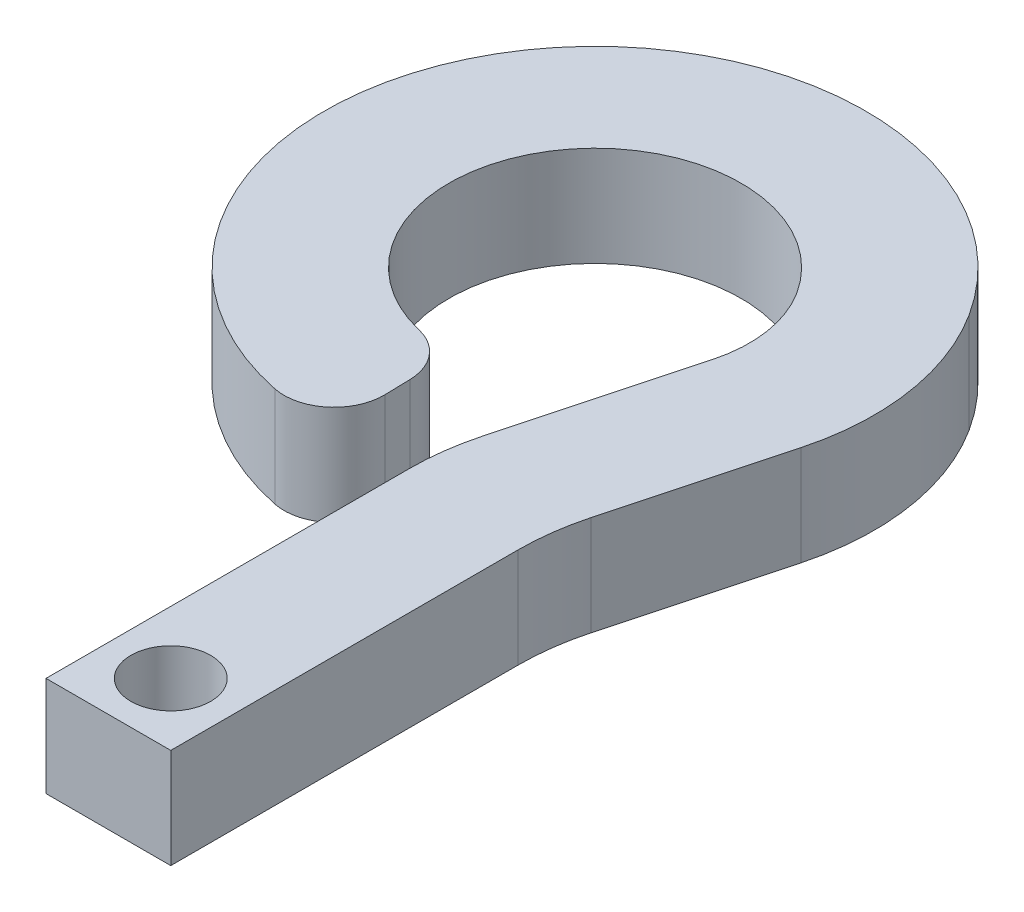
ISO-10303-21;
HEADER;
FILE_DESCRIPTION(('STEP AP214'),'2;1');
FILE_NAME('part.step','',(''),(''),'','','');
FILE_SCHEMA(('AUTOMOTIVE_DESIGN { 1 0 10303 214 1 1 1 1 }'));
ENDSEC;
DATA;
#1=APPLICATION_CONTEXT('core data for automotive mechanical design processes');
#2=APPLICATION_PROTOCOL_DEFINITION('international standard','automotive_design',2000,#1);
#3=PRODUCT_CONTEXT('',#1,'mechanical');
#4=PRODUCT('Part','Part','',(#3));
#5=PRODUCT_RELATED_PRODUCT_CATEGORY('part','',(#4));
#6=PRODUCT_DEFINITION_FORMATION('','',#4);
#7=PRODUCT_DEFINITION_CONTEXT('part definition',#1,'design');
#8=PRODUCT_DEFINITION('design','',#6,#7);
#9=PRODUCT_DEFINITION_SHAPE('','',#8);
#10=(LENGTH_UNIT() NAMED_UNIT(*) SI_UNIT(.MILLI.,.METRE.));
#11=(NAMED_UNIT(*) PLANE_ANGLE_UNIT() SI_UNIT($,.RADIAN.));
#12=(NAMED_UNIT(*) SI_UNIT($,.STERADIAN.) SOLID_ANGLE_UNIT());
#13=UNCERTAINTY_MEASURE_WITH_UNIT(LENGTH_MEASURE(1.E-05),#10,'distance_accuracy_value','');
#14=(GEOMETRIC_REPRESENTATION_CONTEXT(3) GLOBAL_UNCERTAINTY_ASSIGNED_CONTEXT((#13)) GLOBAL_UNIT_ASSIGNED_CONTEXT((#10,
#11,#12)) REPRESENTATION_CONTEXT('',''));
#15=CARTESIAN_POINT('',(0.,0.,0.));
#16=DIRECTION('',(0.,0.,1.));
#17=DIRECTION('',(1.,0.,0.));
#18=AXIS2_PLACEMENT_3D('',#15,#16,#17);
#19=CARTESIAN_POINT('',(0.,-4.,0.));
#20=DIRECTION('',(1.,0.,0.));
#21=DIRECTION('',(0.,0.,-1.));
#22=AXIS2_PLACEMENT_3D('',#19,#20,#21);
#23=PLANE('',#22);
#24=DIRECTION('',(0.,0.,-1.));
#25=VECTOR('',#24,1.);
#26=CARTESIAN_POINT('',(0.,0.,0.));
#27=LINE('',#26,#25);
#28=CARTESIAN_POINT('',(0.,0.,0.));
#29=VERTEX_POINT('',#28);
#30=CARTESIAN_POINT('',(0.,0.,-13.908964275534));
#31=VERTEX_POINT('',#30);
#32=EDGE_CURVE('E186',#29,#31,#27,.T.);
#33=ORIENTED_EDGE('',*,*,#32,.F.);
#34=DIRECTION('',(0.,1.,0.));
#35=VECTOR('',#34,1.);
#36=CARTESIAN_POINT('',(0.,-4.,0.));
#37=LINE('',#36,#35);
#38=CARTESIAN_POINT('',(0.,-4.,0.));
#39=VERTEX_POINT('',#38);
#40=EDGE_CURVE('E158',#39,#29,#37,.T.);
#41=ORIENTED_EDGE('',*,*,#40,.F.);
#42=DIRECTION('',(0.,0.,-1.));
#43=VECTOR('',#42,1.);
#44=CARTESIAN_POINT('',(0.,-4.,0.));
#45=LINE('',#44,#43);
#46=CARTESIAN_POINT('',(0.,-4.,-13.908964275534));
#47=VERTEX_POINT('',#46);
#48=EDGE_CURVE('E153',#39,#47,#45,.T.);
#49=ORIENTED_EDGE('',*,*,#48,.T.);
#50=DIRECTION('',(0.,1.,0.));
#51=VECTOR('',#50,1.);
#52=CARTESIAN_POINT('',(0.,-4.,-13.908964275534));
#53=LINE('',#52,#51);
#54=EDGE_CURVE('E135',#47,#31,#53,.T.);
#55=ORIENTED_EDGE('',*,*,#54,.T.);
#56=EDGE_LOOP('',(#33,#41,#49,#55));
#57=FACE_BOUND('',#56,.T.);
#58=ADVANCED_FACE('F36',(#57),#23,.T.);
#59=CARTESIAN_POINT('',(0.,-4.,0.));
#60=DIRECTION('',(0.,0.,1.));
#61=DIRECTION('',(1.,0.,0.));
#62=AXIS2_PLACEMENT_3D('',#59,#60,#61);
#63=PLANE('',#62);
#64=DIRECTION('',(1.,0.,0.));
#65=VECTOR('',#64,1.);
#66=CARTESIAN_POINT('',(0.,0.,0.));
#67=LINE('',#66,#65);
#68=CARTESIAN_POINT('',(-5.,0.,0.));
#69=VERTEX_POINT('',#68);
#70=EDGE_CURVE('E159',#69,#29,#67,.T.);
#71=ORIENTED_EDGE('',*,*,#70,.F.);
#72=DIRECTION('',(0.,1.,0.));
#73=VECTOR('',#72,1.);
#74=CARTESIAN_POINT('',(-5.,-4.,0.));
#75=LINE('',#74,#73);
#76=CARTESIAN_POINT('',(-5.,-4.,0.));
#77=VERTEX_POINT('',#76);
#78=EDGE_CURVE('E208',#77,#69,#75,.T.);
#79=ORIENTED_EDGE('',*,*,#78,.F.);
#80=DIRECTION('',(1.,0.,0.));
#81=VECTOR('',#80,1.);
#82=CARTESIAN_POINT('',(0.,-4.,0.));
#83=LINE('',#82,#81);
#84=EDGE_CURVE('E146',#77,#39,#83,.T.);
#85=ORIENTED_EDGE('',*,*,#84,.T.);
#86=ORIENTED_EDGE('',*,*,#40,.T.);
#87=EDGE_LOOP('',(#71,#79,#85,#86));
#88=FACE_BOUND('',#87,.T.);
#89=ADVANCED_FACE('F256',(#88),#63,.T.);
#90=CARTESIAN_POINT('',(-5.,-4.,0.));
#91=DIRECTION('',(-1.,0.,0.));
#92=DIRECTION('',(0.,0.,1.));
#93=AXIS2_PLACEMENT_3D('',#90,#91,#92);
#94=PLANE('',#93);
#95=DIRECTION('',(0.,0.,1.));
#96=VECTOR('',#95,1.);
#97=CARTESIAN_POINT('',(-5.,0.,0.));
#98=LINE('',#97,#96);
#99=CARTESIAN_POINT('',(-5.,0.,-14.567226763471));
#100=VERTEX_POINT('',#99);
#101=EDGE_CURVE('E162',#100,#69,#98,.T.);
#102=ORIENTED_EDGE('',*,*,#101,.F.);
#103=DIRECTION('',(0.,1.,0.));
#104=VECTOR('',#103,1.);
#105=CARTESIAN_POINT('',(-5.,-4.,-14.567226763471));
#106=LINE('',#105,#104);
#107=CARTESIAN_POINT('',(-5.,-4.,-14.567226763471));
#108=VERTEX_POINT('',#107);
#109=EDGE_CURVE('E210',#108,#100,#106,.T.);
#110=ORIENTED_EDGE('',*,*,#109,.F.);
#111=DIRECTION('',(0.,0.,1.));
#112=VECTOR('',#111,1.);
#113=CARTESIAN_POINT('',(-5.,-4.,0.));
#114=LINE('',#113,#112);
#115=EDGE_CURVE('E182',#108,#77,#114,.T.);
#116=ORIENTED_EDGE('',*,*,#115,.T.);
#117=ORIENTED_EDGE('',*,*,#78,.T.);
#118=EDGE_LOOP('',(#102,#110,#116,#117));
#119=FACE_BOUND('',#118,.T.);
#120=ADVANCED_FACE('F306',(#119),#94,.T.);
#121=CARTESIAN_POINT('',(5.,-4.,-14.567226763471));
#122=DIRECTION('',(0.,1.,0.));
#123=DIRECTION('',(0.,0.,1.));
#124=AXIS2_PLACEMENT_3D('',#121,#122,#123);
#125=CYLINDRICAL_SURFACE('',#124,10.);
#126=CARTESIAN_POINT('',(5.,0.,-14.567226763471));
#127=DIRECTION('',(0.,1.,0.));
#128=DIRECTION('',(0.,0.,-1.));
#129=AXIS2_PLACEMENT_3D('',#126,#127,#128);
#130=CIRCLE('',#129,10.);
#131=CARTESIAN_POINT('',(-4.65925826289067,0.,-17.1554172144963));
#132=VERTEX_POINT('',#131);
#133=EDGE_CURVE('E201',#132,#100,#130,.T.);
#134=ORIENTED_EDGE('',*,*,#133,.F.);
#135=DIRECTION('',(0.,1.,0.));
#136=VECTOR('',#135,1.);
#137=CARTESIAN_POINT('',(-4.65925826289067,-4.,-17.1554172144963));
#138=LINE('',#137,#136);
#139=CARTESIAN_POINT('',(-4.65925826289067,-4.,-17.1554172144963));
#140=VERTEX_POINT('',#139);
#141=EDGE_CURVE('E212',#140,#132,#138,.T.);
#142=ORIENTED_EDGE('',*,*,#141,.F.);
#143=CARTESIAN_POINT('',(5.,-4.,-14.567226763471));
#144=DIRECTION('',(0.,1.,0.));
#145=DIRECTION('',(0.,0.,-1.));
#146=AXIS2_PLACEMENT_3D('',#143,#144,#145);
#147=CIRCLE('',#146,10.);
#148=EDGE_CURVE('E179',#140,#108,#147,.T.);
#149=ORIENTED_EDGE('',*,*,#148,.T.);
#150=ORIENTED_EDGE('',*,*,#109,.T.);
#151=EDGE_LOOP('',(#134,#142,#149,#150));
#152=FACE_BOUND('',#151,.T.);
#153=ADVANCED_FACE('F264',(#152),#125,.T.);
#154=CARTESIAN_POINT('',(-4.65925826289067,-4.,-17.1554172144963));
#155=DIRECTION('',(-0.965925826289068,0.,-0.258819045102522));
#156=DIRECTION('',(-0.258819045102522,0.,0.965925826289068));
#157=AXIS2_PLACEMENT_3D('',#154,#155,#156);
#158=PLANE('',#157);
#159=DIRECTION('',(-0.258819045102522,0.,0.965925826289068));
#160=VECTOR('',#159,1.);
#161=CARTESIAN_POINT('',(-4.65925826289067,0.,-17.1554172144963));
#162=LINE('',#161,#160);
#163=CARTESIAN_POINT('',(-2.70994743203027,0.,-24.4303442750116));
#164=VERTEX_POINT('',#163);
#165=EDGE_CURVE('E199',#164,#132,#162,.T.);
#166=ORIENTED_EDGE('',*,*,#165,.F.);
#167=DIRECTION('',(0.,-1.,0.));
#168=VECTOR('',#167,1.);
#169=CARTESIAN_POINT('',(-2.70994743203027,-4.,-24.4303442750116));
#170=LINE('',#169,#168);
#171=CARTESIAN_POINT('',(-2.70994743203027,-4.,-24.4303442750116));
#172=VERTEX_POINT('',#171);
#173=EDGE_CURVE('E237',#164,#172,#170,.T.);
#174=ORIENTED_EDGE('',*,*,#173,.T.);
#175=DIRECTION('',(-0.258819045102522,0.,0.965925826289068));
#176=VECTOR('',#175,1.);
#177=CARTESIAN_POINT('',(-4.65925826289067,-4.,-17.1554172144963));
#178=LINE('',#177,#176);
#179=EDGE_CURVE('E177',#172,#140,#178,.T.);
#180=ORIENTED_EDGE('',*,*,#179,.T.);
#181=ORIENTED_EDGE('',*,*,#141,.T.);
#182=EDGE_LOOP('',(#166,#174,#180,#181));
#183=FACE_BOUND('',#182,.T.);
#184=ADVANCED_FACE('F267',(#183),#158,.T.);
#185=CARTESIAN_POINT('',(-8.26003794561906,-4.,-25.2642967400131));
#186=DIRECTION('',(0.,1.,0.));
#187=DIRECTION('',(0.,0.,1.));
#188=AXIS2_PLACEMENT_3D('',#185,#186,#187);
#189=CYLINDRICAL_SURFACE('',#188,5.85486604986444);
#190=CARTESIAN_POINT('',(-8.26003794561906,-4.,-25.2642967400131));
#191=DIRECTION('',(0.,-1.,0.));
#192=DIRECTION('',(0.,0.,-1.));
#193=AXIS2_PLACEMENT_3D('',#190,#191,#192);
#194=CIRCLE('',#193,5.85486604986444);
#195=CARTESIAN_POINT('',(-9.61473586368824,-4.,-19.5683113105519));
#196=VERTEX_POINT('',#195);
#197=CARTESIAN_POINT('',(-3.32569193056908,-4.,-28.4157544766194));
#198=VERTEX_POINT('',#197);
#199=EDGE_CURVE('E174',#196,#198,#194,.T.);
#200=ORIENTED_EDGE('',*,*,#199,.T.);
#201=DIRECTION('',(0.,1.,0.));
#202=VECTOR('',#201,1.);
#203=CARTESIAN_POINT('',(-3.32569193056908,-4.,-28.4157544766194));
#204=LINE('',#203,#202);
#205=CARTESIAN_POINT('',(-3.32569193056908,0.,-28.4157544766194));
#206=VERTEX_POINT('',#205);
#207=EDGE_CURVE('E234',#198,#206,#204,.T.);
#208=ORIENTED_EDGE('',*,*,#207,.T.);
#209=CARTESIAN_POINT('',(-8.26003794561906,0.,-25.2642967400131));
#210=DIRECTION('',(0.,-1.,0.));
#211=DIRECTION('',(0.,0.,-1.));
#212=AXIS2_PLACEMENT_3D('',#209,#210,#211);
#213=CIRCLE('',#212,5.85486604986444);
#214=CARTESIAN_POINT('',(-9.61473586368824,0.,-19.5683113105519));
#215=VERTEX_POINT('',#214);
#216=EDGE_CURVE('E196',#215,#206,#213,.T.);
#217=ORIENTED_EDGE('',*,*,#216,.F.);
#218=DIRECTION('',(0.,1.,0.));
#219=VECTOR('',#218,1.);
#220=CARTESIAN_POINT('',(-9.61473586368824,-4.,-19.5683113105519));
#221=LINE('',#220,#219);
#222=EDGE_CURVE('E232',#215,#196,#221,.F.);
#223=ORIENTED_EDGE('',*,*,#222,.T.);
#224=EDGE_LOOP('',(#200,#208,#217,#223));
#225=FACE_BOUND('',#224,.T.);
#226=ADVANCED_FACE('F276',(#225),#189,.F.);
#227=CARTESIAN_POINT('',(-8.11977943551975,-4.,-19.4111109397672));
#228=DIRECTION('',(0.999713016556783,0.,-0.0239558871039502));
#229=DIRECTION('',(-0.0239558871039502,0.,-0.999713016556783));
#230=AXIS2_PLACEMENT_3D('',#227,#228,#229);
#231=PLANE('',#230);
#232=DIRECTION('',(-0.0239558871039502,0.,-0.999713016556783));
#233=VECTOR('',#232,1.);
#234=CARTESIAN_POINT('',(-8.11977943551975,0.,-19.4111109397672));
#235=LINE('',#234,#233);
#236=CARTESIAN_POINT('',(-8.05339338486362,0.,-16.6407272478276));
#237=VERTEX_POINT('',#236);
#238=CARTESIAN_POINT('',(-8.07806949289028,0.,-17.6704961011021));
#239=VERTEX_POINT('',#238);
#240=EDGE_CURVE('E193',#237,#239,#235,.T.);
#241=ORIENTED_EDGE('',*,*,#240,.F.);
#242=DIRECTION('',(0.,1.,0.));
#243=VECTOR('',#242,1.);
#244=CARTESIAN_POINT('',(-8.05339338486362,-4.,-16.6407272478276));
#245=LINE('',#244,#243);
#246=CARTESIAN_POINT('',(-8.05339338486362,-4.,-16.6407272478276));
#247=VERTEX_POINT('',#246);
#248=EDGE_CURVE('E225',#237,#247,#245,.F.);
#249=ORIENTED_EDGE('',*,*,#248,.T.);
#250=DIRECTION('',(-0.0239558871039502,0.,-0.999713016556783));
#251=VECTOR('',#250,1.);
#252=CARTESIAN_POINT('',(-8.11977943551975,-4.,-19.4111109397672));
#253=LINE('',#252,#251);
#254=CARTESIAN_POINT('',(-8.07806949289028,-4.,-17.6704961011021));
#255=VERTEX_POINT('',#254);
#256=EDGE_CURVE('E171',#247,#255,#253,.T.);
#257=ORIENTED_EDGE('',*,*,#256,.T.);
#258=DIRECTION('',(0.,1.,0.));
#259=VECTOR('',#258,1.);
#260=CARTESIAN_POINT('',(-8.07806949289028,-4.,-17.6704961011021));
#261=LINE('',#260,#259);
#262=EDGE_CURVE('E222',#255,#239,#261,.T.);
#263=ORIENTED_EDGE('',*,*,#262,.T.);
#264=EDGE_LOOP('',(#241,#249,#257,#263));
#265=FACE_BOUND('',#264,.T.);
#266=ADVANCED_FACE('F284',(#265),#231,.T.);
#267=CARTESIAN_POINT('',(-8.26003794561906,-4.,-25.2642967400131));
#268=DIRECTION('',(0.,1.,0.));
#269=DIRECTION('',(0.,0.,1.));
#270=AXIS2_PLACEMENT_3D('',#267,#268,#269);
#271=CYLINDRICAL_SURFACE('',#270,10.8548660498644);
#272=CARTESIAN_POINT('',(-8.26003794561906,0.,-25.2642967400131));
#273=DIRECTION('',(0.,1.,0.));
#274=DIRECTION('',(0.,0.,-1.));
#275=AXIS2_PLACEMENT_3D('',#272,#273,#274);
#276=CIRCLE('',#275,10.8548660498644);
#277=CARTESIAN_POINT('',(0.888192702337443,0.,-31.1070694527146));
#278=VERTEX_POINT('',#277);
#279=CARTESIAN_POINT('',(-10.4577451305204,0.,-14.6342355882637));
#280=VERTEX_POINT('',#279);
#281=EDGE_CURVE('E191',#278,#280,#276,.T.);
#282=ORIENTED_EDGE('',*,*,#281,.F.);
#283=DIRECTION('',(0.,1.,0.));
#284=VECTOR('',#283,1.);
#285=CARTESIAN_POINT('',(0.888192702337443,-4.,-31.1070694527146));
#286=LINE('',#285,#284);
#287=CARTESIAN_POINT('',(0.888192702337443,-4.,-31.1070694527146));
#288=VERTEX_POINT('',#287);
#289=EDGE_CURVE('E44',#278,#288,#286,.F.);
#290=ORIENTED_EDGE('',*,*,#289,.T.);
#291=CARTESIAN_POINT('',(-8.26003794561906,-4.,-25.2642967400131));
#292=DIRECTION('',(0.,1.,0.));
#293=DIRECTION('',(0.,0.,-1.));
#294=AXIS2_PLACEMENT_3D('',#291,#292,#293);
#295=CIRCLE('',#294,10.8548660498644);
#296=CARTESIAN_POINT('',(-10.4577451305204,-4.,-14.6342355882637));
#297=VERTEX_POINT('',#296);
#298=EDGE_CURVE('E169',#288,#297,#295,.T.);
#299=ORIENTED_EDGE('',*,*,#298,.T.);
#300=DIRECTION('',(0.,1.,0.));
#301=VECTOR('',#300,1.);
#302=CARTESIAN_POINT('',(-10.4577451305204,-4.,-14.6342355882637));
#303=LINE('',#302,#301);
#304=EDGE_CURVE('E207',#297,#280,#303,.T.);
#305=ORIENTED_EDGE('',*,*,#304,.T.);
#306=EDGE_LOOP('',(#282,#290,#299,#305));
#307=FACE_BOUND('',#306,.T.);
#308=ADVANCED_FACE('F292',(#307),#271,.T.);
#309=CARTESIAN_POINT('',(0.340741737109328,-4.,-16.4971547265593));
#310=DIRECTION('',(0.965925826289068,0.,0.258819045102521));
#311=DIRECTION('',(0.258819045102521,0.,-0.965925826289068));
#312=AXIS2_PLACEMENT_3D('',#309,#310,#311);
#313=PLANE('',#312);
#314=DIRECTION('',(0.258819045102521,0.,-0.965925826289068));
#315=VECTOR('',#314,1.);
#316=CARTESIAN_POINT('',(0.340741737109328,-4.,-16.4971547265593));
#317=LINE('',#316,#315);
#318=CARTESIAN_POINT('',(0.340741737109328,-4.,-16.4971547265593));
#319=VERTEX_POINT('',#318);
#320=CARTESIAN_POINT('',(2.11968169941507,-4.,-23.136249049499));
#321=VERTEX_POINT('',#320);
#322=EDGE_CURVE('E156',#319,#321,#317,.T.);
#323=ORIENTED_EDGE('',*,*,#322,.T.);
#324=DIRECTION('',(0.,1.,0.));
#325=VECTOR('',#324,1.);
#326=CARTESIAN_POINT('',(2.11968169941507,-4.,-23.136249049499));
#327=LINE('',#326,#325);
#328=CARTESIAN_POINT('',(2.11968169941507,0.,-23.136249049499));
#329=VERTEX_POINT('',#328);
#330=EDGE_CURVE('E243',#321,#329,#327,.T.);
#331=ORIENTED_EDGE('',*,*,#330,.T.);
#332=DIRECTION('',(0.258819045102521,0.,-0.965925826289068));
#333=VECTOR('',#332,1.);
#334=CARTESIAN_POINT('',(0.340741737109328,0.,-16.4971547265593));
#335=LINE('',#334,#333);
#336=CARTESIAN_POINT('',(0.340741737109328,0.,-16.4971547265593));
#337=VERTEX_POINT('',#336);
#338=EDGE_CURVE('E189',#337,#329,#335,.T.);
#339=ORIENTED_EDGE('',*,*,#338,.F.);
#340=DIRECTION('',(0.,1.,0.));
#341=VECTOR('',#340,1.);
#342=CARTESIAN_POINT('',(0.340741737109328,-4.,-16.4971547265593));
#343=LINE('',#342,#341);
#344=EDGE_CURVE('E145',#319,#337,#343,.T.);
#345=ORIENTED_EDGE('',*,*,#344,.F.);
#346=EDGE_LOOP('',(#323,#331,#339,#345));
#347=FACE_BOUND('',#346,.T.);
#348=ADVANCED_FACE('F249',(#347),#313,.T.);
#349=CARTESIAN_POINT('',(10.,-4.,-13.908964275534));
#350=DIRECTION('',(0.,1.,0.));
#351=DIRECTION('',(0.,0.,1.));
#352=AXIS2_PLACEMENT_3D('',#349,#350,#351);
#353=CYLINDRICAL_SURFACE('',#352,10.);
#354=CARTESIAN_POINT('',(10.,0.,-13.908964275534));
#355=DIRECTION('',(0.,-1.,0.));
#356=DIRECTION('',(0.,0.,-1.));
#357=AXIS2_PLACEMENT_3D('',#354,#355,#356);
#358=CIRCLE('',#357,10.);
#359=EDGE_CURVE('E140',#31,#337,#358,.T.);
#360=ORIENTED_EDGE('',*,*,#359,.F.);
#361=ORIENTED_EDGE('',*,*,#54,.F.);
#362=CARTESIAN_POINT('',(10.,-4.,-13.908964275534));
#363=DIRECTION('',(0.,-1.,0.));
#364=DIRECTION('',(0.,0.,-1.));
#365=AXIS2_PLACEMENT_3D('',#362,#363,#364);
#366=CIRCLE('',#365,10.);
#367=EDGE_CURVE('E138',#47,#319,#366,.T.);
#368=ORIENTED_EDGE('',*,*,#367,.T.);
#369=ORIENTED_EDGE('',*,*,#344,.T.);
#370=EDGE_LOOP('',(#360,#361,#368,#369));
#371=FACE_BOUND('',#370,.T.);
#372=ADVANCED_FACE('F137',(#371),#353,.F.);
#373=CARTESIAN_POINT('',(10.,-4.,-13.908964275534));
#374=DIRECTION('',(0.,-1.,0.));
#375=DIRECTION('',(0.,0.,-1.));
#376=AXIS2_PLACEMENT_3D('',#373,#374,#375);
#377=PLANE('',#376);
#378=CARTESIAN_POINT('',(-2.5,-4.,-2.5));
#379=DIRECTION('',(0.,-1.,0.));
#380=DIRECTION('',(0.,0.,-1.));
#381=AXIS2_PLACEMENT_3D('',#378,#379,#380);
#382=CIRCLE('',#381,1.6);
#383=CARTESIAN_POINT('',(-2.5,-4.,-4.1));
#384=VERTEX_POINT('',#383);
#385=EDGE_CURVE('E165',#384,#384,#382,.T.);
#386=ORIENTED_EDGE('',*,*,#385,.F.);
#387=EDGE_LOOP('',(#386));
#388=FACE_BOUND('',#387,.T.);
#389=ORIENTED_EDGE('',*,*,#298,.F.);
#390=CARTESIAN_POINT('',(-7.53957656347561,-4.,-25.7244395005242));
#391=DIRECTION('',(0.,-1.,0.));
#392=DIRECTION('',(0.,0.,-1.));
#393=AXIS2_PLACEMENT_3D('',#390,#391,#392);
#394=CIRCLE('',#393,10.);
#395=EDGE_CURVE('E11',#288,#321,#394,.T.);
#396=ORIENTED_EDGE('',*,*,#395,.T.);
#397=ORIENTED_EDGE('',*,*,#322,.F.);
#398=ORIENTED_EDGE('',*,*,#367,.F.);
#399=ORIENTED_EDGE('',*,*,#48,.F.);
#400=ORIENTED_EDGE('',*,*,#84,.F.);
#401=ORIENTED_EDGE('',*,*,#115,.F.);
#402=ORIENTED_EDGE('',*,*,#148,.F.);
#403=ORIENTED_EDGE('',*,*,#179,.F.);
#404=CARTESIAN_POINT('',(-7.53957656347561,-4.,-25.7244395005242));
#405=DIRECTION('',(0.,-1.,0.));
#406=DIRECTION('',(0.,0.,-1.));
#407=AXIS2_PLACEMENT_3D('',#404,#405,#406);
#408=CIRCLE('',#407,5.);
#409=EDGE_CURVE('E241',#172,#198,#408,.F.);
#410=ORIENTED_EDGE('',*,*,#409,.T.);
#411=ORIENTED_EDGE('',*,*,#199,.F.);
#412=CARTESIAN_POINT('',(-10.0774955260038,-4.,-17.6225843268942));
#413=DIRECTION('',(0.,-1.,0.));
#414=DIRECTION('',(0.,0.,-1.));
#415=AXIS2_PLACEMENT_3D('',#412,#413,#414);
#416=CIRCLE('',#415,2.);
#417=EDGE_CURVE('E227',#196,#255,#416,.T.);
#418=ORIENTED_EDGE('',*,*,#417,.T.);
#419=ORIENTED_EDGE('',*,*,#256,.F.);
#420=CARTESIAN_POINT('',(-10.0528194179772,-4.,-16.5928154736197));
#421=DIRECTION('',(0.,-1.,0.));
#422=DIRECTION('',(0.,0.,-1.));
#423=AXIS2_PLACEMENT_3D('',#420,#421,#422);
#424=CIRCLE('',#423,2.);
#425=EDGE_CURVE('E229',#247,#297,#424,.T.);
#426=ORIENTED_EDGE('',*,*,#425,.T.);
#427=EDGE_LOOP('',(#389,#396,#397,#398,#399,#400,#401,#402,#403,#410,#411,#418,#419,#426));
#428=FACE_BOUND('',#427,.T.);
#429=ADVANCED_FACE('F151',(#388,#428),#377,.T.);
#430=CARTESIAN_POINT('',(10.,0.,-13.908964275534));
#431=DIRECTION('',(0.,-1.,0.));
#432=DIRECTION('',(0.,0.,-1.));
#433=AXIS2_PLACEMENT_3D('',#430,#431,#432);
#434=PLANE('',#433);
#435=CARTESIAN_POINT('',(-2.5,0.,-2.5));
#436=DIRECTION('',(0.,1.,0.));
#437=DIRECTION('',(0.,0.,1.));
#438=AXIS2_PLACEMENT_3D('',#435,#436,#437);
#439=CIRCLE('',#438,1.6);
#440=CARTESIAN_POINT('',(-2.5,0.,-0.9));
#441=VERTEX_POINT('',#440);
#442=EDGE_CURVE('E460',#441,#441,#439,.T.);
#443=ORIENTED_EDGE('',*,*,#442,.F.);
#444=EDGE_LOOP('',(#443));
#445=FACE_BOUND('',#444,.T.);
#446=ORIENTED_EDGE('',*,*,#338,.T.);
#447=CARTESIAN_POINT('',(-7.53957656347561,0.,-25.7244395005242));
#448=DIRECTION('',(0.,-1.,0.));
#449=DIRECTION('',(0.,0.,-1.));
#450=AXIS2_PLACEMENT_3D('',#447,#448,#449);
#451=CIRCLE('',#450,10.);
#452=EDGE_CURVE('E58',#329,#278,#451,.F.);
#453=ORIENTED_EDGE('',*,*,#452,.T.);
#454=ORIENTED_EDGE('',*,*,#281,.T.);
#455=CARTESIAN_POINT('',(-10.0528194179772,0.,-16.5928154736197));
#456=DIRECTION('',(0.,-1.,0.));
#457=DIRECTION('',(0.,0.,-1.));
#458=AXIS2_PLACEMENT_3D('',#455,#456,#457);
#459=CIRCLE('',#458,2.);
#460=EDGE_CURVE('E220',#280,#237,#459,.F.);
#461=ORIENTED_EDGE('',*,*,#460,.T.);
#462=ORIENTED_EDGE('',*,*,#240,.T.);
#463=CARTESIAN_POINT('',(-10.0774955260038,0.,-17.6225843268942));
#464=DIRECTION('',(0.,-1.,0.));
#465=DIRECTION('',(0.,0.,-1.));
#466=AXIS2_PLACEMENT_3D('',#463,#464,#465);
#467=CIRCLE('',#466,2.);
#468=EDGE_CURVE('E218',#239,#215,#467,.F.);
#469=ORIENTED_EDGE('',*,*,#468,.T.);
#470=ORIENTED_EDGE('',*,*,#216,.T.);
#471=CARTESIAN_POINT('',(-7.53957656347561,0.,-25.7244395005242));
#472=DIRECTION('',(0.,-1.,0.));
#473=DIRECTION('',(0.,0.,-1.));
#474=AXIS2_PLACEMENT_3D('',#471,#472,#473);
#475=CIRCLE('',#474,5.);
#476=EDGE_CURVE('E239',#206,#164,#475,.T.);
#477=ORIENTED_EDGE('',*,*,#476,.T.);
#478=ORIENTED_EDGE('',*,*,#165,.T.);
#479=ORIENTED_EDGE('',*,*,#133,.T.);
#480=ORIENTED_EDGE('',*,*,#101,.T.);
#481=ORIENTED_EDGE('',*,*,#70,.T.);
#482=ORIENTED_EDGE('',*,*,#32,.T.);
#483=ORIENTED_EDGE('',*,*,#359,.T.);
#484=EDGE_LOOP('',(#446,#453,#454,#461,#462,#469,#470,#477,#478,#479,#480,#481,#482,#483));
#485=FACE_BOUND('',#484,.T.);
#486=ADVANCED_FACE('F252',(#445,#485),#434,.F.);
#487=CARTESIAN_POINT('',(-10.0528194179772,-4.,-16.5928154736197));
#488=DIRECTION('',(0.,1.,0.));
#489=DIRECTION('',(0.,0.,1.));
#490=AXIS2_PLACEMENT_3D('',#487,#488,#489);
#491=CYLINDRICAL_SURFACE('',#490,2.);
#492=ORIENTED_EDGE('',*,*,#425,.F.);
#493=ORIENTED_EDGE('',*,*,#248,.F.);
#494=ORIENTED_EDGE('',*,*,#460,.F.);
#495=ORIENTED_EDGE('',*,*,#304,.F.);
#496=EDGE_LOOP('',(#492,#493,#494,#495));
#497=FACE_BOUND('',#496,.T.);
#498=ADVANCED_FACE('F290',(#497),#491,.T.);
#499=CARTESIAN_POINT('',(-10.0774955260038,-4.,-17.6225843268942));
#500=DIRECTION('',(0.,1.,0.));
#501=DIRECTION('',(0.,0.,1.));
#502=AXIS2_PLACEMENT_3D('',#499,#500,#501);
#503=CYLINDRICAL_SURFACE('',#502,2.);
#504=ORIENTED_EDGE('',*,*,#417,.F.);
#505=ORIENTED_EDGE('',*,*,#222,.F.);
#506=ORIENTED_EDGE('',*,*,#468,.F.);
#507=ORIENTED_EDGE('',*,*,#262,.F.);
#508=EDGE_LOOP('',(#504,#505,#506,#507));
#509=FACE_BOUND('',#508,.T.);
#510=ADVANCED_FACE('F282',(#509),#503,.T.);
#511=CARTESIAN_POINT('',(-7.53957656347561,-4.,-25.7244395005242));
#512=DIRECTION('',(0.,1.,0.));
#513=DIRECTION('',(0.,0.,1.));
#514=AXIS2_PLACEMENT_3D('',#511,#512,#513);
#515=CYLINDRICAL_SURFACE('',#514,5.);
#516=ORIENTED_EDGE('',*,*,#409,.F.);
#517=ORIENTED_EDGE('',*,*,#173,.F.);
#518=ORIENTED_EDGE('',*,*,#476,.F.);
#519=ORIENTED_EDGE('',*,*,#207,.F.);
#520=EDGE_LOOP('',(#516,#517,#518,#519));
#521=FACE_BOUND('',#520,.T.);
#522=ADVANCED_FACE('F273',(#521),#515,.F.);
#523=CARTESIAN_POINT('',(-7.53957656347561,-4.,-25.7244395005242));
#524=DIRECTION('',(0.,1.,0.));
#525=DIRECTION('',(0.,0.,1.));
#526=AXIS2_PLACEMENT_3D('',#523,#524,#525);
#527=CYLINDRICAL_SURFACE('',#526,10.);
#528=ORIENTED_EDGE('',*,*,#395,.F.);
#529=ORIENTED_EDGE('',*,*,#289,.F.);
#530=ORIENTED_EDGE('',*,*,#452,.F.);
#531=ORIENTED_EDGE('',*,*,#330,.F.);
#532=EDGE_LOOP('',(#528,#529,#530,#531));
#533=FACE_BOUND('',#532,.T.);
#534=ADVANCED_FACE('F38',(#533),#527,.T.);
#535=CARTESIAN_POINT('',(-2.5,-10.,-2.5));
#536=DIRECTION('',(0.,1.,0.));
#537=DIRECTION('',(0.,0.,1.));
#538=AXIS2_PLACEMENT_3D('',#535,#536,#537);
#539=CYLINDRICAL_SURFACE('',#538,1.6);
#540=ORIENTED_EDGE('',*,*,#385,.T.);
#541=EDGE_LOOP('',(#540));
#542=FACE_BOUND('',#541,.T.);
#543=ORIENTED_EDGE('',*,*,#442,.T.);
#544=EDGE_LOOP('',(#543));
#545=FACE_BOUND('',#544,.T.);
#546=ADVANCED_FACE('F294',(#542,#545),#539,.F.);
#547=CLOSED_SHELL('',(#58,#89,#120,#153,#184,#226,#266,#308,#348,#372,#429,#486,#498,#510,#522,
#534,#546));
#548=MANIFOLD_SOLID_BREP('B2',#547);
#549=ADVANCED_BREP_SHAPE_REPRESENTATION('',(#18,#548),#14);
#550=SHAPE_DEFINITION_REPRESENTATION(#9,#549);
ENDSEC;
END-ISO-10303-21;
